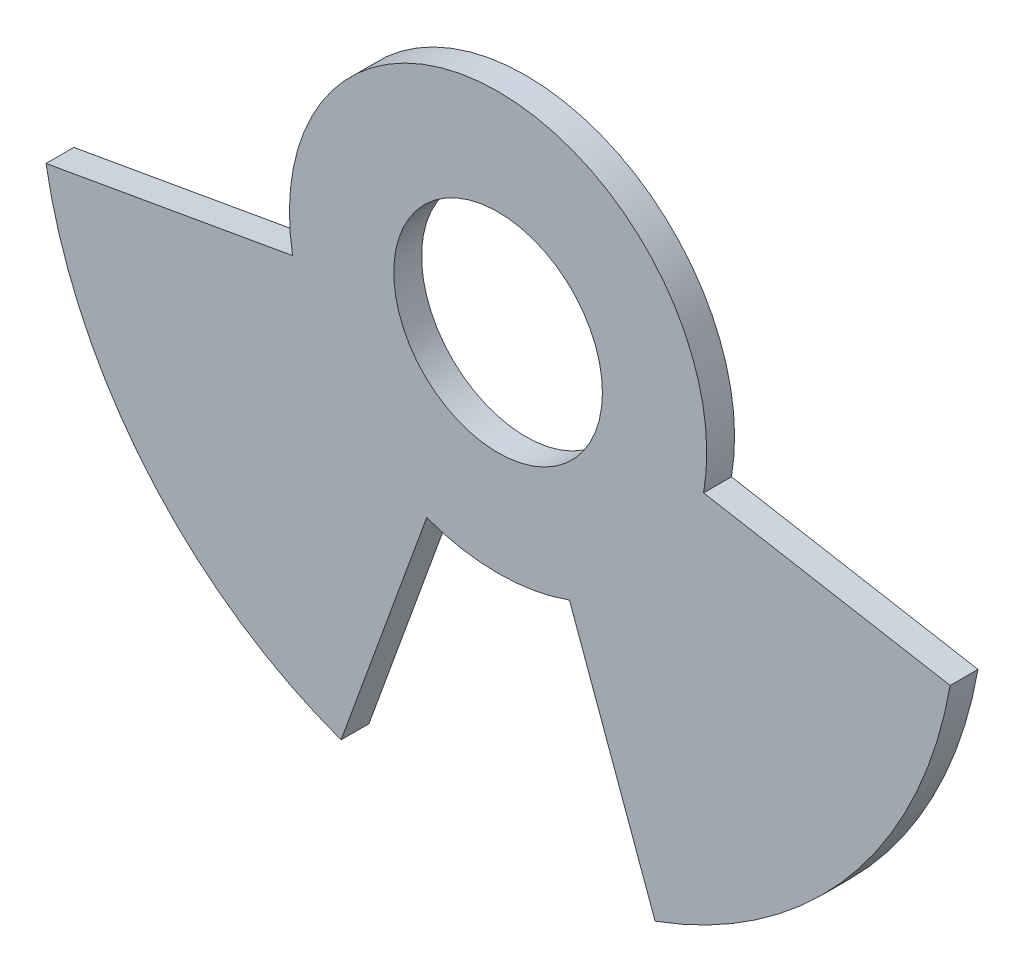
ISO-10303-21;
HEADER;
FILE_DESCRIPTION(('STEP AP214'),'2;1');
FILE_NAME('part.step','',(''),(''),'','','');
FILE_SCHEMA(('AUTOMOTIVE_DESIGN { 1 0 10303 214 1 1 1 1 }'));
ENDSEC;
DATA;
#1=APPLICATION_CONTEXT('core data for automotive mechanical design processes');
#2=APPLICATION_PROTOCOL_DEFINITION('international standard','automotive_design',2000,#1);
#3=PRODUCT_CONTEXT('',#1,'mechanical');
#4=PRODUCT('Part','Part','',(#3));
#5=PRODUCT_RELATED_PRODUCT_CATEGORY('part','',(#4));
#6=PRODUCT_DEFINITION_FORMATION('','',#4);
#7=PRODUCT_DEFINITION_CONTEXT('part definition',#1,'design');
#8=PRODUCT_DEFINITION('design','',#6,#7);
#9=PRODUCT_DEFINITION_SHAPE('','',#8);
#10=(LENGTH_UNIT() NAMED_UNIT(*) SI_UNIT(.MILLI.,.METRE.));
#11=(NAMED_UNIT(*) PLANE_ANGLE_UNIT() SI_UNIT($,.RADIAN.));
#12=(NAMED_UNIT(*) SI_UNIT($,.STERADIAN.) SOLID_ANGLE_UNIT());
#13=UNCERTAINTY_MEASURE_WITH_UNIT(LENGTH_MEASURE(1.E-05),#10,'distance_accuracy_value','');
#14=(GEOMETRIC_REPRESENTATION_CONTEXT(3) GLOBAL_UNCERTAINTY_ASSIGNED_CONTEXT((#13)) GLOBAL_UNIT_ASSIGNED_CONTEXT((#10,
#11,#12)) REPRESENTATION_CONTEXT('',''));
#15=CARTESIAN_POINT('',(0.,0.,0.));
#16=DIRECTION('',(0.,0.,1.));
#17=DIRECTION('',(1.,0.,0.));
#18=AXIS2_PLACEMENT_3D('',#15,#16,#17);
#19=CARTESIAN_POINT('',(0.,0.,0.2));
#20=DIRECTION('',(0.,0.,-1.));
#21=DIRECTION('',(-1.,0.,0.));
#22=AXIS2_PLACEMENT_3D('',#19,#20,#21);
#23=PLANE('',#22);
#24=CARTESIAN_POINT('',(0.,0.,0.2));
#25=DIRECTION('',(0.,0.,1.));
#26=DIRECTION('',(-1.,0.,0.));
#27=AXIS2_PLACEMENT_3D('',#24,#25,#26);
#28=CIRCLE('',#27,3.3);
#29=CARTESIAN_POINT('',(-3.24986558494028,-0.573038986300884,0.2));
#30=VERTEX_POINT('',#29);
#31=CARTESIAN_POINT('',(-1.12866647297469,-3.1009856485935,0.2));
#32=VERTEX_POINT('',#31);
#33=EDGE_CURVE('E144',#30,#32,#28,.T.);
#34=ORIENTED_EDGE('',*,*,#33,.T.);
#35=DIRECTION('',(0.342020143325663,0.93969262078591,0.));
#36=VECTOR('',#35,1.);
#37=CARTESIAN_POINT('',(-0.513030214988494,-1.40953893117887,0.2));
#38=LINE('',#37,#36);
#39=CARTESIAN_POINT('',(-0.513030214988494,-1.40953893117887,0.2));
#40=VERTEX_POINT('',#39);
#41=EDGE_CURVE('E92',#32,#40,#38,.T.);
#42=ORIENTED_EDGE('',*,*,#41,.T.);
#43=CARTESIAN_POINT('',(0.,0.,0.2));
#44=DIRECTION('',(0.,0.,1.));
#45=DIRECTION('',(-1.,0.,0.));
#46=AXIS2_PLACEMENT_3D('',#43,#44,#45);
#47=CIRCLE('',#46,1.5);
#48=CARTESIAN_POINT('',(0.513030214988495,-1.40953893117887,0.2));
#49=VERTEX_POINT('',#48);
#50=EDGE_CURVE('E159',#40,#49,#47,.T.);
#51=ORIENTED_EDGE('',*,*,#50,.T.);
#52=DIRECTION('',(0.342020143325663,-0.93969262078591,0.));
#53=VECTOR('',#52,1.);
#54=CARTESIAN_POINT('',(0.513030214988495,-1.40953893117887,0.2));
#55=LINE('',#54,#53);
#56=CARTESIAN_POINT('',(1.12866647297469,-3.1009856485935,0.2));
#57=VERTEX_POINT('',#56);
#58=EDGE_CURVE('E172',#49,#57,#55,.T.);
#59=ORIENTED_EDGE('',*,*,#58,.T.);
#60=CARTESIAN_POINT('',(0.,0.,0.2));
#61=DIRECTION('',(0.,0.,1.));
#62=DIRECTION('',(1.,0.,0.));
#63=AXIS2_PLACEMENT_3D('',#60,#61,#62);
#64=CIRCLE('',#63,3.3);
#65=CARTESIAN_POINT('',(3.24986558494028,-0.573038986300885,0.2));
#66=VERTEX_POINT('',#65);
#67=EDGE_CURVE('E111',#57,#66,#64,.T.);
#68=ORIENTED_EDGE('',*,*,#67,.T.);
#69=DIRECTION('',(-0.984807753012207,0.173648177666935,0.));
#70=VECTOR('',#69,1.);
#71=CARTESIAN_POINT('',(1.47721162951831,-0.260472266500402,0.2));
#72=LINE('',#71,#70);
#73=CARTESIAN_POINT('',(1.47721162951831,-0.260472266500402,0.2));
#74=VERTEX_POINT('',#73);
#75=EDGE_CURVE('E105',#66,#74,#72,.T.);
#76=ORIENTED_EDGE('',*,*,#75,.T.);
#77=CARTESIAN_POINT('',(0.,0.,0.2));
#78=DIRECTION('',(0.,0.,1.));
#79=DIRECTION('',(1.,0.,0.));
#80=AXIS2_PLACEMENT_3D('',#77,#78,#79);
#81=CIRCLE('',#80,1.5);
#82=CARTESIAN_POINT('',(-1.47721162951831,-0.2604722665004,0.2));
#83=VERTEX_POINT('',#82);
#84=EDGE_CURVE('E109',#74,#83,#81,.T.);
#85=ORIENTED_EDGE('',*,*,#84,.T.);
#86=DIRECTION('',(-0.984807753012207,-0.173648177666935,0.));
#87=VECTOR('',#86,1.);
#88=CARTESIAN_POINT('',(-1.47721162951831,-0.260472266500402,0.2));
#89=LINE('',#88,#87);
#90=EDGE_CURVE('E49',#83,#30,#89,.T.);
#91=ORIENTED_EDGE('',*,*,#90,.T.);
#92=EDGE_LOOP('',(#34,#42,#51,#59,#68,#76,#85,#91));
#93=FACE_BOUND('',#92,.T.);
#94=CARTESIAN_POINT('',(0.,0.,0.2));
#95=DIRECTION('',(0.,0.,1.));
#96=DIRECTION('',(1.,0.,0.));
#97=AXIS2_PLACEMENT_3D('',#94,#95,#96);
#98=CIRCLE('',#97,0.75);
#99=CARTESIAN_POINT('',(0.75,0.,0.2));
#100=VERTEX_POINT('',#99);
#101=EDGE_CURVE('E133',#100,#100,#98,.T.);
#102=ORIENTED_EDGE('',*,*,#101,.F.);
#103=EDGE_LOOP('',(#102));
#104=FACE_BOUND('',#103,.T.);
#105=ADVANCED_FACE('F32',(#93,#104),#23,.F.);
#106=CARTESIAN_POINT('',(0.,0.,0.));
#107=DIRECTION('',(0.,0.,-1.));
#108=DIRECTION('',(-1.,0.,0.));
#109=AXIS2_PLACEMENT_3D('',#106,#107,#108);
#110=PLANE('',#109);
#111=CARTESIAN_POINT('',(0.,0.,0.));
#112=DIRECTION('',(0.,0.,1.));
#113=DIRECTION('',(-1.,0.,0.));
#114=AXIS2_PLACEMENT_3D('',#111,#112,#113);
#115=CIRCLE('',#114,3.3);
#116=CARTESIAN_POINT('',(-3.24986558494028,-0.573038986300884,0.));
#117=VERTEX_POINT('',#116);
#118=CARTESIAN_POINT('',(-1.12866647297469,-3.1009856485935,0.));
#119=VERTEX_POINT('',#118);
#120=EDGE_CURVE('E129',#117,#119,#115,.T.);
#121=ORIENTED_EDGE('',*,*,#120,.F.);
#122=DIRECTION('',(-0.984807753012207,-0.173648177666935,0.));
#123=VECTOR('',#122,1.);
#124=CARTESIAN_POINT('',(-1.47721162951831,-0.260472266500402,0.));
#125=LINE('',#124,#123);
#126=CARTESIAN_POINT('',(-1.47721162951831,-0.2604722665004,0.));
#127=VERTEX_POINT('',#126);
#128=EDGE_CURVE('E84',#127,#117,#125,.T.);
#129=ORIENTED_EDGE('',*,*,#128,.F.);
#130=CARTESIAN_POINT('',(0.,0.,0.));
#131=DIRECTION('',(0.,0.,1.));
#132=DIRECTION('',(1.,0.,0.));
#133=AXIS2_PLACEMENT_3D('',#130,#131,#132);
#134=CIRCLE('',#133,1.5);
#135=CARTESIAN_POINT('',(1.47721162951831,-0.260472266500402,0.));
#136=VERTEX_POINT('',#135);
#137=EDGE_CURVE('E78',#136,#127,#134,.T.);
#138=ORIENTED_EDGE('',*,*,#137,.F.);
#139=DIRECTION('',(-0.984807753012207,0.173648177666935,0.));
#140=VECTOR('',#139,1.);
#141=CARTESIAN_POINT('',(1.47721162951831,-0.260472266500402,0.));
#142=LINE('',#141,#140);
#143=CARTESIAN_POINT('',(3.24986558494028,-0.573038986300885,0.));
#144=VERTEX_POINT('',#143);
#145=EDGE_CURVE('E119',#144,#136,#142,.T.);
#146=ORIENTED_EDGE('',*,*,#145,.F.);
#147=CARTESIAN_POINT('',(0.,0.,0.));
#148=DIRECTION('',(0.,0.,1.));
#149=DIRECTION('',(1.,0.,0.));
#150=AXIS2_PLACEMENT_3D('',#147,#148,#149);
#151=CIRCLE('',#150,3.3);
#152=CARTESIAN_POINT('',(1.12866647297469,-3.1009856485935,0.));
#153=VERTEX_POINT('',#152);
#154=EDGE_CURVE('E139',#153,#144,#151,.T.);
#155=ORIENTED_EDGE('',*,*,#154,.F.);
#156=DIRECTION('',(0.342020143325663,-0.93969262078591,0.));
#157=VECTOR('',#156,1.);
#158=CARTESIAN_POINT('',(0.513030214988495,-1.40953893117887,0.));
#159=LINE('',#158,#157);
#160=CARTESIAN_POINT('',(0.513030214988495,-1.40953893117887,0.));
#161=VERTEX_POINT('',#160);
#162=EDGE_CURVE('E137',#161,#153,#159,.T.);
#163=ORIENTED_EDGE('',*,*,#162,.F.);
#164=CARTESIAN_POINT('',(0.,0.,0.));
#165=DIRECTION('',(0.,0.,1.));
#166=DIRECTION('',(-1.,0.,0.));
#167=AXIS2_PLACEMENT_3D('',#164,#165,#166);
#168=CIRCLE('',#167,1.5);
#169=CARTESIAN_POINT('',(-0.513030214988494,-1.40953893117887,0.));
#170=VERTEX_POINT('',#169);
#171=EDGE_CURVE('E135',#170,#161,#168,.T.);
#172=ORIENTED_EDGE('',*,*,#171,.F.);
#173=DIRECTION('',(0.342020143325663,0.93969262078591,0.));
#174=VECTOR('',#173,1.);
#175=CARTESIAN_POINT('',(-0.513030214988494,-1.40953893117887,0.));
#176=LINE('',#175,#174);
#177=EDGE_CURVE('E132',#119,#170,#176,.T.);
#178=ORIENTED_EDGE('',*,*,#177,.F.);
#179=EDGE_LOOP('',(#121,#129,#138,#146,#155,#163,#172,#178));
#180=FACE_BOUND('',#179,.T.);
#181=CARTESIAN_POINT('',(0.,0.,0.));
#182=DIRECTION('',(0.,0.,1.));
#183=DIRECTION('',(1.,0.,0.));
#184=AXIS2_PLACEMENT_3D('',#181,#182,#183);
#185=CIRCLE('',#184,0.75);
#186=CARTESIAN_POINT('',(0.75,0.,0.));
#187=VERTEX_POINT('',#186);
#188=EDGE_CURVE('E178',#187,#187,#185,.T.);
#189=ORIENTED_EDGE('',*,*,#188,.T.);
#190=EDGE_LOOP('',(#189));
#191=FACE_BOUND('',#190,.T.);
#192=ADVANCED_FACE('F163',(#180,#191),#110,.T.);
#193=CARTESIAN_POINT('',(0.,0.,0.2));
#194=DIRECTION('',(0.,0.,-1.));
#195=DIRECTION('',(-1.,0.,0.));
#196=AXIS2_PLACEMENT_3D('',#193,#194,#195);
#197=CYLINDRICAL_SURFACE('',#196,3.3);
#198=ORIENTED_EDGE('',*,*,#120,.T.);
#199=DIRECTION('',(0.,0.,-1.));
#200=VECTOR('',#199,1.);
#201=CARTESIAN_POINT('',(-1.12866647297469,-3.1009856485935,0.2));
#202=LINE('',#201,#200);
#203=EDGE_CURVE('E11',#32,#119,#202,.T.);
#204=ORIENTED_EDGE('',*,*,#203,.F.);
#205=ORIENTED_EDGE('',*,*,#33,.F.);
#206=DIRECTION('',(0.,0.,-1.));
#207=VECTOR('',#206,1.);
#208=CARTESIAN_POINT('',(-3.24986558494028,-0.573038986300884,0.2));
#209=LINE('',#208,#207);
#210=EDGE_CURVE('E125',#30,#117,#209,.T.);
#211=ORIENTED_EDGE('',*,*,#210,.T.);
#212=EDGE_LOOP('',(#198,#204,#205,#211));
#213=FACE_BOUND('',#212,.T.);
#214=ADVANCED_FACE('F34',(#213),#197,.T.);
#215=CARTESIAN_POINT('',(-0.513030214988494,-1.40953893117887,0.2));
#216=DIRECTION('',(-0.93969262078591,0.342020143325663,0.));
#217=DIRECTION('',(-0.342020143325663,-0.939692620785911,0.));
#218=AXIS2_PLACEMENT_3D('',#215,#216,#217);
#219=PLANE('',#218);
#220=ORIENTED_EDGE('',*,*,#177,.T.);
#221=DIRECTION('',(0.,0.,-1.));
#222=VECTOR('',#221,1.);
#223=CARTESIAN_POINT('',(-0.513030214988494,-1.40953893117887,0.2));
#224=LINE('',#223,#222);
#225=EDGE_CURVE('E41',#40,#170,#224,.T.);
#226=ORIENTED_EDGE('',*,*,#225,.F.);
#227=ORIENTED_EDGE('',*,*,#41,.F.);
#228=ORIENTED_EDGE('',*,*,#203,.T.);
#229=EDGE_LOOP('',(#220,#226,#227,#228));
#230=FACE_BOUND('',#229,.T.);
#231=ADVANCED_FACE('F206',(#230),#219,.F.);
#232=CARTESIAN_POINT('',(0.,0.,0.2));
#233=DIRECTION('',(0.,0.,-1.));
#234=DIRECTION('',(-1.,0.,0.));
#235=AXIS2_PLACEMENT_3D('',#232,#233,#234);
#236=CYLINDRICAL_SURFACE('',#235,1.5);
#237=ORIENTED_EDGE('',*,*,#171,.T.);
#238=DIRECTION('',(0.,0.,-1.));
#239=VECTOR('',#238,1.);
#240=CARTESIAN_POINT('',(0.513030214988495,-1.40953893117887,0.2));
#241=LINE('',#240,#239);
#242=EDGE_CURVE('E151',#49,#161,#241,.T.);
#243=ORIENTED_EDGE('',*,*,#242,.F.);
#244=ORIENTED_EDGE('',*,*,#50,.F.);
#245=ORIENTED_EDGE('',*,*,#225,.T.);
#246=EDGE_LOOP('',(#237,#243,#244,#245));
#247=FACE_BOUND('',#246,.T.);
#248=ADVANCED_FACE('F157',(#247),#236,.T.);
#249=CARTESIAN_POINT('',(0.513030214988495,-1.40953893117887,0.2));
#250=DIRECTION('',(0.93969262078591,0.342020143325663,0.));
#251=DIRECTION('',(-0.342020143325663,0.939692620785911,0.));
#252=AXIS2_PLACEMENT_3D('',#249,#250,#251);
#253=PLANE('',#252);
#254=ORIENTED_EDGE('',*,*,#162,.T.);
#255=DIRECTION('',(0.,0.,-1.));
#256=VECTOR('',#255,1.);
#257=CARTESIAN_POINT('',(1.12866647297469,-3.1009856485935,0.2));
#258=LINE('',#257,#256);
#259=EDGE_CURVE('E148',#57,#153,#258,.T.);
#260=ORIENTED_EDGE('',*,*,#259,.F.);
#261=ORIENTED_EDGE('',*,*,#58,.F.);
#262=ORIENTED_EDGE('',*,*,#242,.T.);
#263=EDGE_LOOP('',(#254,#260,#261,#262));
#264=FACE_BOUND('',#263,.T.);
#265=ADVANCED_FACE('F168',(#264),#253,.F.);
#266=CARTESIAN_POINT('',(0.,0.,0.2));
#267=DIRECTION('',(0.,0.,-1.));
#268=DIRECTION('',(-1.,0.,0.));
#269=AXIS2_PLACEMENT_3D('',#266,#267,#268);
#270=CYLINDRICAL_SURFACE('',#269,3.3);
#271=ORIENTED_EDGE('',*,*,#154,.T.);
#272=DIRECTION('',(0.,0.,-1.));
#273=VECTOR('',#272,1.);
#274=CARTESIAN_POINT('',(3.24986558494028,-0.573038986300885,0.2));
#275=LINE('',#274,#273);
#276=EDGE_CURVE('E120',#66,#144,#275,.T.);
#277=ORIENTED_EDGE('',*,*,#276,.F.);
#278=ORIENTED_EDGE('',*,*,#67,.F.);
#279=ORIENTED_EDGE('',*,*,#259,.T.);
#280=EDGE_LOOP('',(#271,#277,#278,#279));
#281=FACE_BOUND('',#280,.T.);
#282=ADVANCED_FACE('F171',(#281),#270,.T.);
#283=CARTESIAN_POINT('',(1.47721162951831,-0.260472266500402,0.2));
#284=DIRECTION('',(-0.173648177666935,-0.984807753012207,0.));
#285=DIRECTION('',(0.984807753012207,-0.173648177666935,0.));
#286=AXIS2_PLACEMENT_3D('',#283,#284,#285);
#287=PLANE('',#286);
#288=ORIENTED_EDGE('',*,*,#145,.T.);
#289=DIRECTION('',(0.,0.,-1.));
#290=VECTOR('',#289,1.);
#291=CARTESIAN_POINT('',(1.47721162951831,-0.260472266500402,0.2));
#292=LINE('',#291,#290);
#293=EDGE_CURVE('E116',#74,#136,#292,.T.);
#294=ORIENTED_EDGE('',*,*,#293,.F.);
#295=ORIENTED_EDGE('',*,*,#75,.F.);
#296=ORIENTED_EDGE('',*,*,#276,.T.);
#297=EDGE_LOOP('',(#288,#294,#295,#296));
#298=FACE_BOUND('',#297,.T.);
#299=ADVANCED_FACE('F117',(#298),#287,.F.);
#300=CARTESIAN_POINT('',(0.,0.,0.2));
#301=DIRECTION('',(0.,0.,-1.));
#302=DIRECTION('',(-1.,0.,0.));
#303=AXIS2_PLACEMENT_3D('',#300,#301,#302);
#304=CYLINDRICAL_SURFACE('',#303,1.5);
#305=ORIENTED_EDGE('',*,*,#137,.T.);
#306=DIRECTION('',(0.,0.,-1.));
#307=VECTOR('',#306,1.);
#308=CARTESIAN_POINT('',(-1.47721162951831,-0.2604722665004,0.2));
#309=LINE('',#308,#307);
#310=EDGE_CURVE('E121',#83,#127,#309,.T.);
#311=ORIENTED_EDGE('',*,*,#310,.F.);
#312=ORIENTED_EDGE('',*,*,#84,.F.);
#313=ORIENTED_EDGE('',*,*,#293,.T.);
#314=EDGE_LOOP('',(#305,#311,#312,#313));
#315=FACE_BOUND('',#314,.T.);
#316=ADVANCED_FACE('F123',(#315),#304,.T.);
#317=CARTESIAN_POINT('',(-1.47721162951831,-0.260472266500402,0.2));
#318=DIRECTION('',(0.173648177666935,-0.984807753012207,0.));
#319=DIRECTION('',(0.984807753012207,0.173648177666935,0.));
#320=AXIS2_PLACEMENT_3D('',#317,#318,#319);
#321=PLANE('',#320);
#322=ORIENTED_EDGE('',*,*,#128,.T.);
#323=ORIENTED_EDGE('',*,*,#210,.F.);
#324=ORIENTED_EDGE('',*,*,#90,.F.);
#325=ORIENTED_EDGE('',*,*,#310,.T.);
#326=EDGE_LOOP('',(#322,#323,#324,#325));
#327=FACE_BOUND('',#326,.T.);
#328=ADVANCED_FACE('F194',(#327),#321,.F.);
#329=CARTESIAN_POINT('',(0.,0.,0.2));
#330=DIRECTION('',(0.,0.,-1.));
#331=DIRECTION('',(-1.,0.,0.));
#332=AXIS2_PLACEMENT_3D('',#329,#330,#331);
#333=CYLINDRICAL_SURFACE('',#332,0.75);
#334=ORIENTED_EDGE('',*,*,#101,.T.);
#335=EDGE_LOOP('',(#334));
#336=FACE_BOUND('',#335,.T.);
#337=ORIENTED_EDGE('',*,*,#188,.F.);
#338=EDGE_LOOP('',(#337));
#339=FACE_BOUND('',#338,.T.);
#340=ADVANCED_FACE('F184',(#336,#339),#333,.F.);
#341=CLOSED_SHELL('',(#105,#192,#214,#231,#248,#265,#282,#299,#316,#328,#340));
#342=MANIFOLD_SOLID_BREP('B2',#341);
#343=ADVANCED_BREP_SHAPE_REPRESENTATION('',(#18,#342),#14);
#344=SHAPE_DEFINITION_REPRESENTATION(#9,#343);
ENDSEC;
END-ISO-10303-21;
